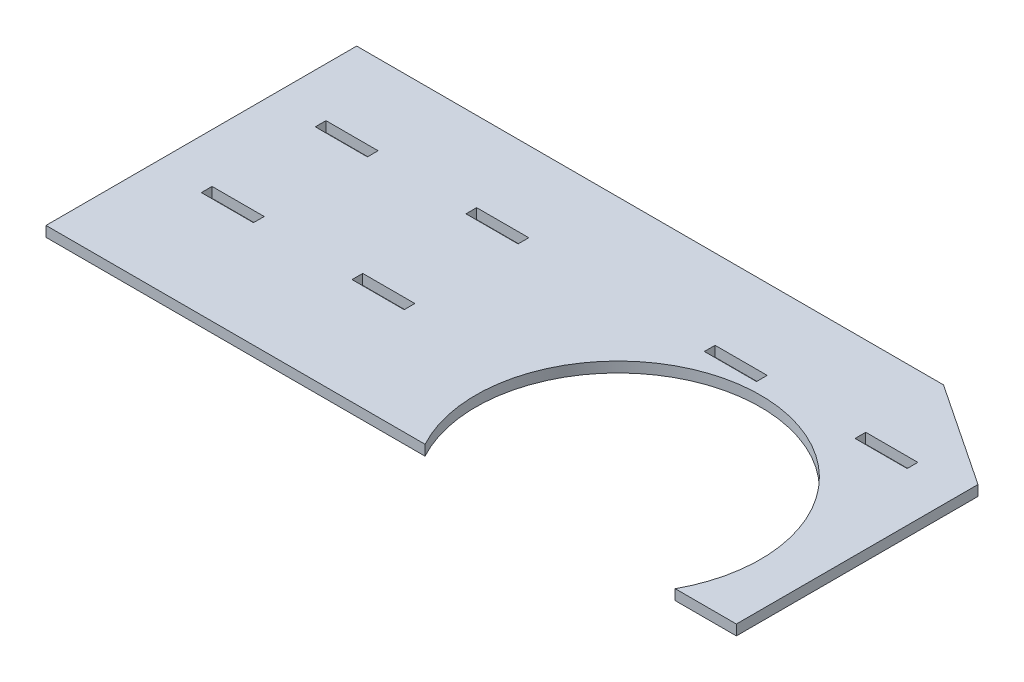
ISO-10303-21;
HEADER;
FILE_DESCRIPTION(('STEP AP214'),'2;1');
FILE_NAME('part.step','',(''),(''),'','','');
FILE_SCHEMA(('AUTOMOTIVE_DESIGN { 1 0 10303 214 1 1 1 1 }'));
ENDSEC;
DATA;
#1=APPLICATION_CONTEXT('core data for automotive mechanical design processes');
#2=APPLICATION_PROTOCOL_DEFINITION('international standard','automotive_design',2000,#1);
#3=PRODUCT_CONTEXT('',#1,'mechanical');
#4=PRODUCT('Part','Part','',(#3));
#5=PRODUCT_RELATED_PRODUCT_CATEGORY('part','',(#4));
#6=PRODUCT_DEFINITION_FORMATION('','',#4);
#7=PRODUCT_DEFINITION_CONTEXT('part definition',#1,'design');
#8=PRODUCT_DEFINITION('design','',#6,#7);
#9=PRODUCT_DEFINITION_SHAPE('','',#8);
#10=(LENGTH_UNIT() NAMED_UNIT(*) SI_UNIT(.MILLI.,.METRE.));
#11=(NAMED_UNIT(*) PLANE_ANGLE_UNIT() SI_UNIT($,.RADIAN.));
#12=(NAMED_UNIT(*) SI_UNIT($,.STERADIAN.) SOLID_ANGLE_UNIT());
#13=UNCERTAINTY_MEASURE_WITH_UNIT(LENGTH_MEASURE(1.E-05),#10,'distance_accuracy_value','');
#14=(GEOMETRIC_REPRESENTATION_CONTEXT(3) GLOBAL_UNCERTAINTY_ASSIGNED_CONTEXT((#13)) GLOBAL_UNIT_ASSIGNED_CONTEXT((#10,
#11,#12)) REPRESENTATION_CONTEXT('',''));
#15=CARTESIAN_POINT('',(0.,0.,0.));
#16=DIRECTION('',(0.,0.,1.));
#17=DIRECTION('',(1.,0.,0.));
#18=AXIS2_PLACEMENT_3D('',#15,#16,#17);
#19=CARTESIAN_POINT('',(146.05,3.,-19.69));
#20=DIRECTION('',(0.,1.,0.));
#21=DIRECTION('',(0.,0.,1.));
#22=AXIS2_PLACEMENT_3D('',#19,#20,#21);
#23=PLANE('',#22);
#24=DIRECTION('',(0.,0.,1.));
#25=VECTOR('',#24,1.);
#26=CARTESIAN_POINT('',(0.,3.,0.));
#27=LINE('',#26,#25);
#28=CARTESIAN_POINT('',(0.,3.,-90.));
#29=VERTEX_POINT('',#28);
#30=CARTESIAN_POINT('',(0.,3.,0.));
#31=VERTEX_POINT('',#30);
#32=EDGE_CURVE('E433',#29,#31,#27,.T.);
#33=ORIENTED_EDGE('',*,*,#32,.T.);
#34=DIRECTION('',(1.,0.,0.));
#35=VECTOR('',#34,1.);
#36=CARTESIAN_POINT('',(0.,3.,0.));
#37=LINE('',#36,#35);
#38=CARTESIAN_POINT('',(109.814085495189,3.,0.));
#39=VERTEX_POINT('',#38);
#40=EDGE_CURVE('E436',#31,#39,#37,.T.);
#41=ORIENTED_EDGE('',*,*,#40,.T.);
#42=CARTESIAN_POINT('',(146.05,3.,-19.69));
#43=DIRECTION('',(0.,-1.,0.));
#44=DIRECTION('',(0.,0.,1.));
#45=AXIS2_PLACEMENT_3D('',#42,#43,#44);
#46=CIRCLE('',#45,41.24);
#47=CARTESIAN_POINT('',(182.285914504811,3.,0.));
#48=VERTEX_POINT('',#47);
#49=EDGE_CURVE('E439',#39,#48,#46,.T.);
#50=ORIENTED_EDGE('',*,*,#49,.T.);
#51=DIRECTION('',(1.,0.,0.));
#52=VECTOR('',#51,1.);
#53=CARTESIAN_POINT('',(182.285914504811,3.,0.));
#54=LINE('',#53,#52);
#55=CARTESIAN_POINT('',(200.,3.,0.));
#56=VERTEX_POINT('',#55);
#57=EDGE_CURVE('E441',#48,#56,#54,.T.);
#58=ORIENTED_EDGE('',*,*,#57,.T.);
#59=DIRECTION('',(0.,0.,-1.));
#60=VECTOR('',#59,1.);
#61=CARTESIAN_POINT('',(200.,3.,0.));
#62=LINE('',#61,#60);
#63=CARTESIAN_POINT('',(200.,3.,-70.));
#64=VERTEX_POINT('',#63);
#65=EDGE_CURVE('E443',#56,#64,#62,.T.);
#66=ORIENTED_EDGE('',*,*,#65,.T.);
#67=DIRECTION('',(-0.832050294337844,0.,-0.554700196225229));
#68=VECTOR('',#67,1.);
#69=CARTESIAN_POINT('',(170.,3.,-90.));
#70=LINE('',#69,#68);
#71=CARTESIAN_POINT('',(170.,3.,-90.));
#72=VERTEX_POINT('',#71);
#73=EDGE_CURVE('E445',#64,#72,#70,.T.);
#74=ORIENTED_EDGE('',*,*,#73,.T.);
#75=DIRECTION('',(-1.,0.,0.));
#76=VECTOR('',#75,1.);
#77=CARTESIAN_POINT('',(0.,3.,-90.));
#78=LINE('',#77,#76);
#79=EDGE_CURVE('E447',#72,#29,#78,.T.);
#80=ORIENTED_EDGE('',*,*,#79,.T.);
#81=EDGE_LOOP('',(#33,#41,#50,#58,#66,#74,#80));
#82=FACE_BOUND('',#81,.T.);
#83=DIRECTION('',(1.,0.,0.));
#84=VECTOR('',#83,1.);
#85=CARTESIAN_POINT('',(14.27,3.,-63.74));
#86=LINE('',#85,#84);
#87=CARTESIAN_POINT('',(14.27,3.,-63.74));
#88=VERTEX_POINT('',#87);
#89=CARTESIAN_POINT('',(29.37,3.,-63.74));
#90=VERTEX_POINT('',#89);
#91=EDGE_CURVE('E404',#88,#90,#86,.T.);
#92=ORIENTED_EDGE('',*,*,#91,.F.);
#93=DIRECTION('',(0.,0.,1.));
#94=VECTOR('',#93,1.);
#95=CARTESIAN_POINT('',(14.27,3.,-66.84));
#96=LINE('',#95,#94);
#97=CARTESIAN_POINT('',(14.27,3.,-66.84));
#98=VERTEX_POINT('',#97);
#99=EDGE_CURVE('E402',#98,#88,#96,.T.);
#100=ORIENTED_EDGE('',*,*,#99,.F.);
#101=DIRECTION('',(-1.,0.,0.));
#102=VECTOR('',#101,1.);
#103=CARTESIAN_POINT('',(14.27,3.,-66.84));
#104=LINE('',#103,#102);
#105=CARTESIAN_POINT('',(29.37,3.,-66.84));
#106=VERTEX_POINT('',#105);
#107=EDGE_CURVE('E410',#106,#98,#104,.T.);
#108=ORIENTED_EDGE('',*,*,#107,.F.);
#109=DIRECTION('',(0.,0.,-1.));
#110=VECTOR('',#109,1.);
#111=CARTESIAN_POINT('',(29.37,3.,-66.84));
#112=LINE('',#111,#110);
#113=EDGE_CURVE('E407',#90,#106,#112,.T.);
#114=ORIENTED_EDGE('',*,*,#113,.F.);
#115=EDGE_LOOP('',(#92,#100,#108,#114));
#116=FACE_BOUND('',#115,.T.);
#117=DIRECTION('',(1.,0.,0.));
#118=VECTOR('',#117,1.);
#119=CARTESIAN_POINT('',(14.27,3.,-30.74));
#120=LINE('',#119,#118);
#121=CARTESIAN_POINT('',(14.27,3.,-30.74));
#122=VERTEX_POINT('',#121);
#123=CARTESIAN_POINT('',(29.37,3.,-30.74));
#124=VERTEX_POINT('',#123);
#125=EDGE_CURVE('E373',#122,#124,#120,.T.);
#126=ORIENTED_EDGE('',*,*,#125,.F.);
#127=DIRECTION('',(0.,0.,1.));
#128=VECTOR('',#127,1.);
#129=CARTESIAN_POINT('',(14.27,3.,-33.84));
#130=LINE('',#129,#128);
#131=CARTESIAN_POINT('',(14.27,3.,-33.84));
#132=VERTEX_POINT('',#131);
#133=EDGE_CURVE('E371',#132,#122,#130,.T.);
#134=ORIENTED_EDGE('',*,*,#133,.F.);
#135=DIRECTION('',(-1.,0.,0.));
#136=VECTOR('',#135,1.);
#137=CARTESIAN_POINT('',(14.27,3.,-33.84));
#138=LINE('',#137,#136);
#139=CARTESIAN_POINT('',(29.37,3.,-33.84));
#140=VERTEX_POINT('',#139);
#141=EDGE_CURVE('E379',#140,#132,#138,.T.);
#142=ORIENTED_EDGE('',*,*,#141,.F.);
#143=DIRECTION('',(0.,0.,-1.));
#144=VECTOR('',#143,1.);
#145=CARTESIAN_POINT('',(29.37,3.,-33.84));
#146=LINE('',#145,#144);
#147=EDGE_CURVE('E376',#124,#140,#146,.T.);
#148=ORIENTED_EDGE('',*,*,#147,.F.);
#149=EDGE_LOOP('',(#126,#134,#142,#148));
#150=FACE_BOUND('',#149,.T.);
#151=DIRECTION('',(-1.,0.,0.));
#152=VECTOR('',#151,1.);
#153=CARTESIAN_POINT('',(73.02,3.,-33.84));
#154=LINE('',#153,#152);
#155=CARTESIAN_POINT('',(73.02,3.,-33.84));
#156=VERTEX_POINT('',#155);
#157=CARTESIAN_POINT('',(57.92,3.,-33.84));
#158=VERTEX_POINT('',#157);
#159=EDGE_CURVE('E342',#156,#158,#154,.T.);
#160=ORIENTED_EDGE('',*,*,#159,.F.);
#161=DIRECTION('',(0.,0.,-1.));
#162=VECTOR('',#161,1.);
#163=CARTESIAN_POINT('',(73.02,3.,-33.84));
#164=LINE('',#163,#162);
#165=CARTESIAN_POINT('',(73.02,3.,-30.74));
#166=VERTEX_POINT('',#165);
#167=EDGE_CURVE('E340',#166,#156,#164,.T.);
#168=ORIENTED_EDGE('',*,*,#167,.F.);
#169=DIRECTION('',(1.,0.,0.));
#170=VECTOR('',#169,1.);
#171=CARTESIAN_POINT('',(73.02,3.,-30.74));
#172=LINE('',#171,#170);
#173=CARTESIAN_POINT('',(57.92,3.,-30.74));
#174=VERTEX_POINT('',#173);
#175=EDGE_CURVE('E348',#174,#166,#172,.T.);
#176=ORIENTED_EDGE('',*,*,#175,.F.);
#177=DIRECTION('',(0.,0.,1.));
#178=VECTOR('',#177,1.);
#179=CARTESIAN_POINT('',(57.92,3.,-33.84));
#180=LINE('',#179,#178);
#181=EDGE_CURVE('E345',#158,#174,#180,.T.);
#182=ORIENTED_EDGE('',*,*,#181,.F.);
#183=EDGE_LOOP('',(#160,#168,#176,#182));
#184=FACE_BOUND('',#183,.T.);
#185=DIRECTION('',(-1.,0.,0.));
#186=VECTOR('',#185,1.);
#187=CARTESIAN_POINT('',(73.02,3.,-66.84));
#188=LINE('',#187,#186);
#189=CARTESIAN_POINT('',(73.02,3.,-66.84));
#190=VERTEX_POINT('',#189);
#191=CARTESIAN_POINT('',(57.92,3.,-66.84));
#192=VERTEX_POINT('',#191);
#193=EDGE_CURVE('E311',#190,#192,#188,.T.);
#194=ORIENTED_EDGE('',*,*,#193,.F.);
#195=DIRECTION('',(0.,0.,-1.));
#196=VECTOR('',#195,1.);
#197=CARTESIAN_POINT('',(73.02,3.,-66.84));
#198=LINE('',#197,#196);
#199=CARTESIAN_POINT('',(73.02,3.,-63.74));
#200=VERTEX_POINT('',#199);
#201=EDGE_CURVE('E309',#200,#190,#198,.T.);
#202=ORIENTED_EDGE('',*,*,#201,.F.);
#203=DIRECTION('',(1.,0.,0.));
#204=VECTOR('',#203,1.);
#205=CARTESIAN_POINT('',(73.02,3.,-63.74));
#206=LINE('',#205,#204);
#207=CARTESIAN_POINT('',(57.92,3.,-63.74));
#208=VERTEX_POINT('',#207);
#209=EDGE_CURVE('E317',#208,#200,#206,.T.);
#210=ORIENTED_EDGE('',*,*,#209,.F.);
#211=DIRECTION('',(0.,0.,1.));
#212=VECTOR('',#211,1.);
#213=CARTESIAN_POINT('',(57.92,3.,-66.84));
#214=LINE('',#213,#212);
#215=EDGE_CURVE('E314',#192,#208,#214,.T.);
#216=ORIENTED_EDGE('',*,*,#215,.F.);
#217=EDGE_LOOP('',(#194,#202,#210,#216));
#218=FACE_BOUND('',#217,.T.);
#219=DIRECTION('',(1.,0.,0.));
#220=VECTOR('',#219,1.);
#221=CARTESIAN_POINT('',(126.99,3.,-63.74));
#222=LINE('',#221,#220);
#223=CARTESIAN_POINT('',(126.99,3.,-63.74));
#224=VERTEX_POINT('',#223);
#225=CARTESIAN_POINT('',(142.09,3.,-63.74));
#226=VERTEX_POINT('',#225);
#227=EDGE_CURVE('E280',#224,#226,#222,.T.);
#228=ORIENTED_EDGE('',*,*,#227,.F.);
#229=DIRECTION('',(0.,0.,1.));
#230=VECTOR('',#229,1.);
#231=CARTESIAN_POINT('',(126.99,3.,-66.84));
#232=LINE('',#231,#230);
#233=CARTESIAN_POINT('',(126.99,3.,-66.84));
#234=VERTEX_POINT('',#233);
#235=EDGE_CURVE('E278',#234,#224,#232,.T.);
#236=ORIENTED_EDGE('',*,*,#235,.F.);
#237=DIRECTION('',(-1.,0.,0.));
#238=VECTOR('',#237,1.);
#239=CARTESIAN_POINT('',(126.99,3.,-66.84));
#240=LINE('',#239,#238);
#241=CARTESIAN_POINT('',(142.09,3.,-66.84));
#242=VERTEX_POINT('',#241);
#243=EDGE_CURVE('E286',#242,#234,#240,.T.);
#244=ORIENTED_EDGE('',*,*,#243,.F.);
#245=DIRECTION('',(0.,0.,-1.));
#246=VECTOR('',#245,1.);
#247=CARTESIAN_POINT('',(142.09,3.,-66.84));
#248=LINE('',#247,#246);
#249=EDGE_CURVE('E283',#226,#242,#248,.T.);
#250=ORIENTED_EDGE('',*,*,#249,.F.);
#251=EDGE_LOOP('',(#228,#236,#244,#250));
#252=FACE_BOUND('',#251,.T.);
#253=DIRECTION('',(1.,0.,0.));
#254=VECTOR('',#253,1.);
#255=CARTESIAN_POINT('',(170.64,3.,-63.74));
#256=LINE('',#255,#254);
#257=CARTESIAN_POINT('',(170.64,3.,-63.74));
#258=VERTEX_POINT('',#257);
#259=CARTESIAN_POINT('',(185.74,3.,-63.74));
#260=VERTEX_POINT('',#259);
#261=EDGE_CURVE('E250',#258,#260,#256,.T.);
#262=ORIENTED_EDGE('',*,*,#261,.F.);
#263=DIRECTION('',(0.,0.,1.));
#264=VECTOR('',#263,1.);
#265=CARTESIAN_POINT('',(170.64,3.,-66.84));
#266=LINE('',#265,#264);
#267=CARTESIAN_POINT('',(170.64,3.,-66.84));
#268=VERTEX_POINT('',#267);
#269=EDGE_CURVE('E242',#268,#258,#266,.T.);
#270=ORIENTED_EDGE('',*,*,#269,.F.);
#271=DIRECTION('',(-1.,0.,0.));
#272=VECTOR('',#271,1.);
#273=CARTESIAN_POINT('',(170.64,3.,-66.84));
#274=LINE('',#273,#272);
#275=CARTESIAN_POINT('',(185.74,3.,-66.84));
#276=VERTEX_POINT('',#275);
#277=EDGE_CURVE('E264',#276,#268,#274,.T.);
#278=ORIENTED_EDGE('',*,*,#277,.F.);
#279=DIRECTION('',(0.,0.,-1.));
#280=VECTOR('',#279,1.);
#281=CARTESIAN_POINT('',(185.74,3.,-66.84));
#282=LINE('',#281,#280);
#283=EDGE_CURVE('E262',#260,#276,#282,.T.);
#284=ORIENTED_EDGE('',*,*,#283,.F.);
#285=EDGE_LOOP('',(#262,#270,#278,#284));
#286=FACE_BOUND('',#285,.T.);
#287=ADVANCED_FACE('F39',(#82,#116,#150,#184,#218,#252,#286),#23,.T.);
#288=CARTESIAN_POINT('',(146.05,0.,-19.69));
#289=DIRECTION('',(0.,1.,0.));
#290=DIRECTION('',(0.,0.,1.));
#291=AXIS2_PLACEMENT_3D('',#288,#289,#290);
#292=PLANE('',#291);
#293=DIRECTION('',(0.,0.,1.));
#294=VECTOR('',#293,1.);
#295=CARTESIAN_POINT('',(126.99,0.,-66.84));
#296=LINE('',#295,#294);
#297=CARTESIAN_POINT('',(126.99,0.,-66.84));
#298=VERTEX_POINT('',#297);
#299=CARTESIAN_POINT('',(126.99,0.,-63.74));
#300=VERTEX_POINT('',#299);
#301=EDGE_CURVE('E258',#298,#300,#296,.T.);
#302=ORIENTED_EDGE('',*,*,#301,.T.);
#303=DIRECTION('',(1.,0.,0.));
#304=VECTOR('',#303,1.);
#305=CARTESIAN_POINT('',(126.99,0.,-63.74));
#306=LINE('',#305,#304);
#307=CARTESIAN_POINT('',(142.09,0.,-63.74));
#308=VERTEX_POINT('',#307);
#309=EDGE_CURVE('E291',#300,#308,#306,.T.);
#310=ORIENTED_EDGE('',*,*,#309,.T.);
#311=DIRECTION('',(0.,0.,-1.));
#312=VECTOR('',#311,1.);
#313=CARTESIAN_POINT('',(142.09,0.,-66.84));
#314=LINE('',#313,#312);
#315=CARTESIAN_POINT('',(142.09,0.,-66.84));
#316=VERTEX_POINT('',#315);
#317=EDGE_CURVE('E294',#308,#316,#314,.T.);
#318=ORIENTED_EDGE('',*,*,#317,.T.);
#319=DIRECTION('',(-1.,0.,0.));
#320=VECTOR('',#319,1.);
#321=CARTESIAN_POINT('',(126.99,0.,-66.84));
#322=LINE('',#321,#320);
#323=EDGE_CURVE('E281',#316,#298,#322,.T.);
#324=ORIENTED_EDGE('',*,*,#323,.T.);
#325=EDGE_LOOP('',(#302,#310,#318,#324));
#326=FACE_BOUND('',#325,.T.);
#327=DIRECTION('',(0.,0.,-1.));
#328=VECTOR('',#327,1.);
#329=CARTESIAN_POINT('',(73.02,0.,-33.84));
#330=LINE('',#329,#328);
#331=CARTESIAN_POINT('',(73.02,0.,-30.74));
#332=VERTEX_POINT('',#331);
#333=CARTESIAN_POINT('',(73.02,0.,-33.84));
#334=VERTEX_POINT('',#333);
#335=EDGE_CURVE('E339',#332,#334,#330,.T.);
#336=ORIENTED_EDGE('',*,*,#335,.T.);
#337=DIRECTION('',(-1.,0.,0.));
#338=VECTOR('',#337,1.);
#339=CARTESIAN_POINT('',(73.02,0.,-33.84));
#340=LINE('',#339,#338);
#341=CARTESIAN_POINT('',(57.92,0.,-33.84));
#342=VERTEX_POINT('',#341);
#343=EDGE_CURVE('E353',#334,#342,#340,.T.);
#344=ORIENTED_EDGE('',*,*,#343,.T.);
#345=DIRECTION('',(0.,0.,1.));
#346=VECTOR('',#345,1.);
#347=CARTESIAN_POINT('',(57.92,0.,-33.84));
#348=LINE('',#347,#346);
#349=CARTESIAN_POINT('',(57.92,0.,-30.74));
#350=VERTEX_POINT('',#349);
#351=EDGE_CURVE('E356',#342,#350,#348,.T.);
#352=ORIENTED_EDGE('',*,*,#351,.T.);
#353=DIRECTION('',(1.,0.,0.));
#354=VECTOR('',#353,1.);
#355=CARTESIAN_POINT('',(73.02,0.,-30.74));
#356=LINE('',#355,#354);
#357=EDGE_CURVE('E343',#350,#332,#356,.T.);
#358=ORIENTED_EDGE('',*,*,#357,.T.);
#359=EDGE_LOOP('',(#336,#344,#352,#358));
#360=FACE_BOUND('',#359,.T.);
#361=DIRECTION('',(0.,0.,1.));
#362=VECTOR('',#361,1.);
#363=CARTESIAN_POINT('',(14.27,0.,-66.84));
#364=LINE('',#363,#362);
#365=CARTESIAN_POINT('',(14.27,0.,-66.84));
#366=VERTEX_POINT('',#365);
#367=CARTESIAN_POINT('',(14.27,0.,-63.74));
#368=VERTEX_POINT('',#367);
#369=EDGE_CURVE('E401',#366,#368,#364,.T.);
#370=ORIENTED_EDGE('',*,*,#369,.T.);
#371=DIRECTION('',(1.,0.,0.));
#372=VECTOR('',#371,1.);
#373=CARTESIAN_POINT('',(14.27,0.,-63.74));
#374=LINE('',#373,#372);
#375=CARTESIAN_POINT('',(29.37,0.,-63.74));
#376=VERTEX_POINT('',#375);
#377=EDGE_CURVE('E415',#368,#376,#374,.T.);
#378=ORIENTED_EDGE('',*,*,#377,.T.);
#379=DIRECTION('',(0.,0.,-1.));
#380=VECTOR('',#379,1.);
#381=CARTESIAN_POINT('',(29.37,0.,-66.84));
#382=LINE('',#381,#380);
#383=CARTESIAN_POINT('',(29.37,0.,-66.84));
#384=VERTEX_POINT('',#383);
#385=EDGE_CURVE('E418',#376,#384,#382,.T.);
#386=ORIENTED_EDGE('',*,*,#385,.T.);
#387=DIRECTION('',(-1.,0.,0.));
#388=VECTOR('',#387,1.);
#389=CARTESIAN_POINT('',(14.27,0.,-66.84));
#390=LINE('',#389,#388);
#391=EDGE_CURVE('E405',#384,#366,#390,.T.);
#392=ORIENTED_EDGE('',*,*,#391,.T.);
#393=EDGE_LOOP('',(#370,#378,#386,#392));
#394=FACE_BOUND('',#393,.T.);
#395=DIRECTION('',(0.,0.,1.));
#396=VECTOR('',#395,1.);
#397=CARTESIAN_POINT('',(0.,0.,0.));
#398=LINE('',#397,#396);
#399=CARTESIAN_POINT('',(0.,0.,-90.));
#400=VERTEX_POINT('',#399);
#401=CARTESIAN_POINT('',(0.,0.,0.));
#402=VERTEX_POINT('',#401);
#403=EDGE_CURVE('E432',#400,#402,#398,.T.);
#404=ORIENTED_EDGE('',*,*,#403,.F.);
#405=DIRECTION('',(-1.,0.,0.));
#406=VECTOR('',#405,1.);
#407=CARTESIAN_POINT('',(0.,0.,-90.));
#408=LINE('',#407,#406);
#409=CARTESIAN_POINT('',(170.,0.,-90.));
#410=VERTEX_POINT('',#409);
#411=EDGE_CURVE('E437',#410,#400,#408,.T.);
#412=ORIENTED_EDGE('',*,*,#411,.F.);
#413=DIRECTION('',(-0.832050294337844,0.,-0.554700196225229));
#414=VECTOR('',#413,1.);
#415=CARTESIAN_POINT('',(170.,0.,-90.));
#416=LINE('',#415,#414);
#417=CARTESIAN_POINT('',(200.,0.,-70.));
#418=VERTEX_POINT('',#417);
#419=EDGE_CURVE('E460',#418,#410,#416,.T.);
#420=ORIENTED_EDGE('',*,*,#419,.F.);
#421=DIRECTION('',(0.,0.,-1.));
#422=VECTOR('',#421,1.);
#423=CARTESIAN_POINT('',(200.,0.,0.));
#424=LINE('',#423,#422);
#425=CARTESIAN_POINT('',(200.,0.,0.));
#426=VERTEX_POINT('',#425);
#427=EDGE_CURVE('E458',#426,#418,#424,.T.);
#428=ORIENTED_EDGE('',*,*,#427,.F.);
#429=DIRECTION('',(1.,0.,0.));
#430=VECTOR('',#429,1.);
#431=CARTESIAN_POINT('',(182.285914504811,0.,0.));
#432=LINE('',#431,#430);
#433=CARTESIAN_POINT('',(182.285914504811,0.,0.));
#434=VERTEX_POINT('',#433);
#435=EDGE_CURVE('E456',#434,#426,#432,.T.);
#436=ORIENTED_EDGE('',*,*,#435,.F.);
#437=CARTESIAN_POINT('',(146.05,0.,-19.69));
#438=DIRECTION('',(0.,-1.,0.));
#439=DIRECTION('',(0.,0.,1.));
#440=AXIS2_PLACEMENT_3D('',#437,#438,#439);
#441=CIRCLE('',#440,41.24);
#442=CARTESIAN_POINT('',(109.814085495189,0.,0.));
#443=VERTEX_POINT('',#442);
#444=EDGE_CURVE('E454',#443,#434,#441,.T.);
#445=ORIENTED_EDGE('',*,*,#444,.F.);
#446=DIRECTION('',(1.,0.,0.));
#447=VECTOR('',#446,1.);
#448=CARTESIAN_POINT('',(0.,0.,0.));
#449=LINE('',#448,#447);
#450=EDGE_CURVE('E452',#402,#443,#449,.T.);
#451=ORIENTED_EDGE('',*,*,#450,.F.);
#452=EDGE_LOOP('',(#404,#412,#420,#428,#436,#445,#451));
#453=FACE_BOUND('',#452,.T.);
#454=DIRECTION('',(0.,0.,1.));
#455=VECTOR('',#454,1.);
#456=CARTESIAN_POINT('',(14.27,0.,-33.84));
#457=LINE('',#456,#455);
#458=CARTESIAN_POINT('',(14.27,0.,-33.84));
#459=VERTEX_POINT('',#458);
#460=CARTESIAN_POINT('',(14.27,0.,-30.74));
#461=VERTEX_POINT('',#460);
#462=EDGE_CURVE('E370',#459,#461,#457,.T.);
#463=ORIENTED_EDGE('',*,*,#462,.T.);
#464=DIRECTION('',(1.,0.,0.));
#465=VECTOR('',#464,1.);
#466=CARTESIAN_POINT('',(14.27,0.,-30.74));
#467=LINE('',#466,#465);
#468=CARTESIAN_POINT('',(29.37,0.,-30.74));
#469=VERTEX_POINT('',#468);
#470=EDGE_CURVE('E384',#461,#469,#467,.T.);
#471=ORIENTED_EDGE('',*,*,#470,.T.);
#472=DIRECTION('',(0.,0.,-1.));
#473=VECTOR('',#472,1.);
#474=CARTESIAN_POINT('',(29.37,0.,-33.84));
#475=LINE('',#474,#473);
#476=CARTESIAN_POINT('',(29.37,0.,-33.84));
#477=VERTEX_POINT('',#476);
#478=EDGE_CURVE('E387',#469,#477,#475,.T.);
#479=ORIENTED_EDGE('',*,*,#478,.T.);
#480=DIRECTION('',(-1.,0.,0.));
#481=VECTOR('',#480,1.);
#482=CARTESIAN_POINT('',(14.27,0.,-33.84));
#483=LINE('',#482,#481);
#484=EDGE_CURVE('E374',#477,#459,#483,.T.);
#485=ORIENTED_EDGE('',*,*,#484,.T.);
#486=EDGE_LOOP('',(#463,#471,#479,#485));
#487=FACE_BOUND('',#486,.T.);
#488=DIRECTION('',(0.,0.,-1.));
#489=VECTOR('',#488,1.);
#490=CARTESIAN_POINT('',(73.02,0.,-66.84));
#491=LINE('',#490,#489);
#492=CARTESIAN_POINT('',(73.02,0.,-63.74));
#493=VERTEX_POINT('',#492);
#494=CARTESIAN_POINT('',(73.02,0.,-66.84));
#495=VERTEX_POINT('',#494);
#496=EDGE_CURVE('E308',#493,#495,#491,.T.);
#497=ORIENTED_EDGE('',*,*,#496,.T.);
#498=DIRECTION('',(-1.,0.,0.));
#499=VECTOR('',#498,1.);
#500=CARTESIAN_POINT('',(73.02,0.,-66.84));
#501=LINE('',#500,#499);
#502=CARTESIAN_POINT('',(57.92,0.,-66.84));
#503=VERTEX_POINT('',#502);
#504=EDGE_CURVE('E322',#495,#503,#501,.T.);
#505=ORIENTED_EDGE('',*,*,#504,.T.);
#506=DIRECTION('',(0.,0.,1.));
#507=VECTOR('',#506,1.);
#508=CARTESIAN_POINT('',(57.92,0.,-66.84));
#509=LINE('',#508,#507);
#510=CARTESIAN_POINT('',(57.92,0.,-63.74));
#511=VERTEX_POINT('',#510);
#512=EDGE_CURVE('E325',#503,#511,#509,.T.);
#513=ORIENTED_EDGE('',*,*,#512,.T.);
#514=DIRECTION('',(1.,0.,0.));
#515=VECTOR('',#514,1.);
#516=CARTESIAN_POINT('',(73.02,0.,-63.74));
#517=LINE('',#516,#515);
#518=EDGE_CURVE('E312',#511,#493,#517,.T.);
#519=ORIENTED_EDGE('',*,*,#518,.T.);
#520=EDGE_LOOP('',(#497,#505,#513,#519));
#521=FACE_BOUND('',#520,.T.);
#522=DIRECTION('',(0.,0.,1.));
#523=VECTOR('',#522,1.);
#524=CARTESIAN_POINT('',(170.64,0.,-66.84));
#525=LINE('',#524,#523);
#526=CARTESIAN_POINT('',(170.64,0.,-66.84));
#527=VERTEX_POINT('',#526);
#528=CARTESIAN_POINT('',(170.64,0.,-63.74));
#529=VERTEX_POINT('',#528);
#530=EDGE_CURVE('E62',#527,#529,#525,.T.);
#531=ORIENTED_EDGE('',*,*,#530,.T.);
#532=DIRECTION('',(1.,0.,0.));
#533=VECTOR('',#532,1.);
#534=CARTESIAN_POINT('',(170.64,0.,-63.74));
#535=LINE('',#534,#533);
#536=CARTESIAN_POINT('',(185.74,0.,-63.74));
#537=VERTEX_POINT('',#536);
#538=EDGE_CURVE('E257',#529,#537,#535,.T.);
#539=ORIENTED_EDGE('',*,*,#538,.T.);
#540=DIRECTION('',(0.,0.,-1.));
#541=VECTOR('',#540,1.);
#542=CARTESIAN_POINT('',(185.74,0.,-66.84));
#543=LINE('',#542,#541);
#544=CARTESIAN_POINT('',(185.74,0.,-66.84));
#545=VERTEX_POINT('',#544);
#546=EDGE_CURVE('E270',#537,#545,#543,.T.);
#547=ORIENTED_EDGE('',*,*,#546,.T.);
#548=DIRECTION('',(-1.,0.,0.));
#549=VECTOR('',#548,1.);
#550=CARTESIAN_POINT('',(170.64,0.,-66.84));
#551=LINE('',#550,#549);
#552=EDGE_CURVE('E251',#545,#527,#551,.T.);
#553=ORIENTED_EDGE('',*,*,#552,.T.);
#554=EDGE_LOOP('',(#531,#539,#547,#553));
#555=FACE_BOUND('',#554,.T.);
#556=ADVANCED_FACE('F487',(#326,#360,#394,#453,#487,#521,#555),#292,.F.);
#557=CARTESIAN_POINT('',(0.,3.,0.));
#558=DIRECTION('',(1.,0.,0.));
#559=DIRECTION('',(0.,0.,-1.));
#560=AXIS2_PLACEMENT_3D('',#557,#558,#559);
#561=PLANE('',#560);
#562=ORIENTED_EDGE('',*,*,#403,.T.);
#563=DIRECTION('',(0.,-1.,0.));
#564=VECTOR('',#563,1.);
#565=CARTESIAN_POINT('',(0.,3.,0.));
#566=LINE('',#565,#564);
#567=EDGE_CURVE('E11',#31,#402,#566,.T.);
#568=ORIENTED_EDGE('',*,*,#567,.F.);
#569=ORIENTED_EDGE('',*,*,#32,.F.);
#570=DIRECTION('',(0.,-1.,0.));
#571=VECTOR('',#570,1.);
#572=CARTESIAN_POINT('',(0.,3.,-90.));
#573=LINE('',#572,#571);
#574=EDGE_CURVE('E449',#29,#400,#573,.T.);
#575=ORIENTED_EDGE('',*,*,#574,.T.);
#576=EDGE_LOOP('',(#562,#568,#569,#575));
#577=FACE_BOUND('',#576,.T.);
#578=ADVANCED_FACE('F41',(#577),#561,.F.);
#579=CARTESIAN_POINT('',(0.,3.,0.));
#580=DIRECTION('',(0.,0.,-1.));
#581=DIRECTION('',(-1.,0.,0.));
#582=AXIS2_PLACEMENT_3D('',#579,#580,#581);
#583=PLANE('',#582);
#584=ORIENTED_EDGE('',*,*,#450,.T.);
#585=DIRECTION('',(0.,-1.,0.));
#586=VECTOR('',#585,1.);
#587=CARTESIAN_POINT('',(109.814085495189,3.,0.));
#588=LINE('',#587,#586);
#589=EDGE_CURVE('E47',#39,#443,#588,.T.);
#590=ORIENTED_EDGE('',*,*,#589,.F.);
#591=ORIENTED_EDGE('',*,*,#40,.F.);
#592=ORIENTED_EDGE('',*,*,#567,.T.);
#593=EDGE_LOOP('',(#584,#590,#591,#592));
#594=FACE_BOUND('',#593,.T.);
#595=ADVANCED_FACE('F505',(#594),#583,.F.);
#596=CARTESIAN_POINT('',(146.05,3.,-19.69));
#597=DIRECTION('',(0.,-1.,0.));
#598=DIRECTION('',(0.,0.,-1.));
#599=AXIS2_PLACEMENT_3D('',#596,#597,#598);
#600=CYLINDRICAL_SURFACE('',#599,41.24);
#601=ORIENTED_EDGE('',*,*,#444,.T.);
#602=DIRECTION('',(0.,-1.,0.));
#603=VECTOR('',#602,1.);
#604=CARTESIAN_POINT('',(182.285914504811,3.,0.));
#605=LINE('',#604,#603);
#606=EDGE_CURVE('E474',#48,#434,#605,.T.);
#607=ORIENTED_EDGE('',*,*,#606,.F.);
#608=ORIENTED_EDGE('',*,*,#49,.F.);
#609=ORIENTED_EDGE('',*,*,#589,.T.);
#610=EDGE_LOOP('',(#601,#607,#608,#609));
#611=FACE_BOUND('',#610,.T.);
#612=ADVANCED_FACE('F481',(#611),#600,.F.);
#613=CARTESIAN_POINT('',(182.285914504811,3.,0.));
#614=DIRECTION('',(0.,0.,-1.));
#615=DIRECTION('',(-1.,0.,0.));
#616=AXIS2_PLACEMENT_3D('',#613,#614,#615);
#617=PLANE('',#616);
#618=ORIENTED_EDGE('',*,*,#435,.T.);
#619=DIRECTION('',(0.,-1.,0.));
#620=VECTOR('',#619,1.);
#621=CARTESIAN_POINT('',(200.,3.,0.));
#622=LINE('',#621,#620);
#623=EDGE_CURVE('E471',#56,#426,#622,.T.);
#624=ORIENTED_EDGE('',*,*,#623,.F.);
#625=ORIENTED_EDGE('',*,*,#57,.F.);
#626=ORIENTED_EDGE('',*,*,#606,.T.);
#627=EDGE_LOOP('',(#618,#624,#625,#626));
#628=FACE_BOUND('',#627,.T.);
#629=ADVANCED_FACE('F493',(#628),#617,.F.);
#630=CARTESIAN_POINT('',(200.,3.,0.));
#631=DIRECTION('',(-1.,0.,0.));
#632=DIRECTION('',(0.,0.,1.));
#633=AXIS2_PLACEMENT_3D('',#630,#631,#632);
#634=PLANE('',#633);
#635=ORIENTED_EDGE('',*,*,#427,.T.);
#636=DIRECTION('',(0.,-1.,0.));
#637=VECTOR('',#636,1.);
#638=CARTESIAN_POINT('',(200.,3.,-70.));
#639=LINE('',#638,#637);
#640=EDGE_CURVE('E468',#64,#418,#639,.T.);
#641=ORIENTED_EDGE('',*,*,#640,.F.);
#642=ORIENTED_EDGE('',*,*,#65,.F.);
#643=ORIENTED_EDGE('',*,*,#623,.T.);
#644=EDGE_LOOP('',(#635,#641,#642,#643));
#645=FACE_BOUND('',#644,.T.);
#646=ADVANCED_FACE('F497',(#645),#634,.F.);
#647=CARTESIAN_POINT('',(170.,3.,-90.));
#648=DIRECTION('',(-0.554700196225229,0.,0.832050294337844));
#649=DIRECTION('',(0.832050294337844,0.,0.554700196225229));
#650=AXIS2_PLACEMENT_3D('',#647,#648,#649);
#651=PLANE('',#650);
#652=ORIENTED_EDGE('',*,*,#419,.T.);
#653=DIRECTION('',(0.,-1.,0.));
#654=VECTOR('',#653,1.);
#655=CARTESIAN_POINT('',(170.,3.,-90.));
#656=LINE('',#655,#654);
#657=EDGE_CURVE('E465',#72,#410,#656,.T.);
#658=ORIENTED_EDGE('',*,*,#657,.F.);
#659=ORIENTED_EDGE('',*,*,#73,.F.);
#660=ORIENTED_EDGE('',*,*,#640,.T.);
#661=EDGE_LOOP('',(#652,#658,#659,#660));
#662=FACE_BOUND('',#661,.T.);
#663=ADVANCED_FACE('F513',(#662),#651,.F.);
#664=CARTESIAN_POINT('',(0.,3.,-90.));
#665=DIRECTION('',(0.,0.,1.));
#666=DIRECTION('',(1.,0.,0.));
#667=AXIS2_PLACEMENT_3D('',#664,#665,#666);
#668=PLANE('',#667);
#669=ORIENTED_EDGE('',*,*,#411,.T.);
#670=ORIENTED_EDGE('',*,*,#574,.F.);
#671=ORIENTED_EDGE('',*,*,#79,.F.);
#672=ORIENTED_EDGE('',*,*,#657,.T.);
#673=EDGE_LOOP('',(#669,#670,#671,#672));
#674=FACE_BOUND('',#673,.T.);
#675=ADVANCED_FACE('F510',(#674),#668,.F.);
#676=CARTESIAN_POINT('',(14.27,3.,-66.84));
#677=DIRECTION('',(1.,0.,0.));
#678=DIRECTION('',(0.,0.,-1.));
#679=AXIS2_PLACEMENT_3D('',#676,#677,#678);
#680=PLANE('',#679);
#681=ORIENTED_EDGE('',*,*,#369,.F.);
#682=DIRECTION('',(0.,-1.,0.));
#683=VECTOR('',#682,1.);
#684=CARTESIAN_POINT('',(14.27,3.,-66.84));
#685=LINE('',#684,#683);
#686=EDGE_CURVE('E412',#98,#366,#685,.T.);
#687=ORIENTED_EDGE('',*,*,#686,.F.);
#688=ORIENTED_EDGE('',*,*,#99,.T.);
#689=DIRECTION('',(0.,-1.,0.));
#690=VECTOR('',#689,1.);
#691=CARTESIAN_POINT('',(14.27,3.,-63.74));
#692=LINE('',#691,#690);
#693=EDGE_CURVE('E429',#88,#368,#692,.T.);
#694=ORIENTED_EDGE('',*,*,#693,.T.);
#695=EDGE_LOOP('',(#681,#687,#688,#694));
#696=FACE_BOUND('',#695,.T.);
#697=ADVANCED_FACE('F520',(#696),#680,.T.);
#698=CARTESIAN_POINT('',(14.27,3.,-63.74));
#699=DIRECTION('',(0.,0.,-1.));
#700=DIRECTION('',(-1.,0.,0.));
#701=AXIS2_PLACEMENT_3D('',#698,#699,#700);
#702=PLANE('',#701);
#703=ORIENTED_EDGE('',*,*,#377,.F.);
#704=ORIENTED_EDGE('',*,*,#693,.F.);
#705=ORIENTED_EDGE('',*,*,#91,.T.);
#706=DIRECTION('',(0.,-1.,0.));
#707=VECTOR('',#706,1.);
#708=CARTESIAN_POINT('',(29.37,3.,-63.74));
#709=LINE('',#708,#707);
#710=EDGE_CURVE('E427',#90,#376,#709,.T.);
#711=ORIENTED_EDGE('',*,*,#710,.T.);
#712=EDGE_LOOP('',(#703,#704,#705,#711));
#713=FACE_BOUND('',#712,.T.);
#714=ADVANCED_FACE('F533',(#713),#702,.T.);
#715=CARTESIAN_POINT('',(29.37,3.,-66.84));
#716=DIRECTION('',(-1.,0.,0.));
#717=DIRECTION('',(0.,0.,1.));
#718=AXIS2_PLACEMENT_3D('',#715,#716,#717);
#719=PLANE('',#718);
#720=ORIENTED_EDGE('',*,*,#385,.F.);
#721=ORIENTED_EDGE('',*,*,#710,.F.);
#722=ORIENTED_EDGE('',*,*,#113,.T.);
#723=DIRECTION('',(0.,-1.,0.));
#724=VECTOR('',#723,1.);
#725=CARTESIAN_POINT('',(29.37,3.,-66.84));
#726=LINE('',#725,#724);
#727=EDGE_CURVE('E425',#106,#384,#726,.T.);
#728=ORIENTED_EDGE('',*,*,#727,.T.);
#729=EDGE_LOOP('',(#720,#721,#722,#728));
#730=FACE_BOUND('',#729,.T.);
#731=ADVANCED_FACE('F537',(#730),#719,.T.);
#732=CARTESIAN_POINT('',(14.27,3.,-66.84));
#733=DIRECTION('',(0.,0.,1.));
#734=DIRECTION('',(1.,0.,0.));
#735=AXIS2_PLACEMENT_3D('',#732,#733,#734);
#736=PLANE('',#735);
#737=ORIENTED_EDGE('',*,*,#391,.F.);
#738=ORIENTED_EDGE('',*,*,#727,.F.);
#739=ORIENTED_EDGE('',*,*,#107,.T.);
#740=ORIENTED_EDGE('',*,*,#686,.T.);
#741=EDGE_LOOP('',(#737,#738,#739,#740));
#742=FACE_BOUND('',#741,.T.);
#743=ADVANCED_FACE('F541',(#742),#736,.T.);
#744=CARTESIAN_POINT('',(14.27,3.,-33.84));
#745=DIRECTION('',(1.,0.,0.));
#746=DIRECTION('',(0.,0.,-1.));
#747=AXIS2_PLACEMENT_3D('',#744,#745,#746);
#748=PLANE('',#747);
#749=ORIENTED_EDGE('',*,*,#462,.F.);
#750=DIRECTION('',(0.,-1.,0.));
#751=VECTOR('',#750,1.);
#752=CARTESIAN_POINT('',(14.27,3.,-33.84));
#753=LINE('',#752,#751);
#754=EDGE_CURVE('E381',#132,#459,#753,.T.);
#755=ORIENTED_EDGE('',*,*,#754,.F.);
#756=ORIENTED_EDGE('',*,*,#133,.T.);
#757=DIRECTION('',(0.,-1.,0.));
#758=VECTOR('',#757,1.);
#759=CARTESIAN_POINT('',(14.27,3.,-30.74));
#760=LINE('',#759,#758);
#761=EDGE_CURVE('E398',#122,#461,#760,.T.);
#762=ORIENTED_EDGE('',*,*,#761,.T.);
#763=EDGE_LOOP('',(#749,#755,#756,#762));
#764=FACE_BOUND('',#763,.T.);
#765=ADVANCED_FACE('F545',(#764),#748,.T.);
#766=CARTESIAN_POINT('',(14.27,3.,-30.74));
#767=DIRECTION('',(0.,0.,-1.));
#768=DIRECTION('',(-1.,0.,0.));
#769=AXIS2_PLACEMENT_3D('',#766,#767,#768);
#770=PLANE('',#769);
#771=ORIENTED_EDGE('',*,*,#470,.F.);
#772=ORIENTED_EDGE('',*,*,#761,.F.);
#773=ORIENTED_EDGE('',*,*,#125,.T.);
#774=DIRECTION('',(0.,-1.,0.));
#775=VECTOR('',#774,1.);
#776=CARTESIAN_POINT('',(29.37,3.,-30.74));
#777=LINE('',#776,#775);
#778=EDGE_CURVE('E396',#124,#469,#777,.T.);
#779=ORIENTED_EDGE('',*,*,#778,.T.);
#780=EDGE_LOOP('',(#771,#772,#773,#779));
#781=FACE_BOUND('',#780,.T.);
#782=ADVANCED_FACE('F549',(#781),#770,.T.);
#783=CARTESIAN_POINT('',(29.37,3.,-33.84));
#784=DIRECTION('',(-1.,0.,0.));
#785=DIRECTION('',(0.,0.,1.));
#786=AXIS2_PLACEMENT_3D('',#783,#784,#785);
#787=PLANE('',#786);
#788=ORIENTED_EDGE('',*,*,#478,.F.);
#789=ORIENTED_EDGE('',*,*,#778,.F.);
#790=ORIENTED_EDGE('',*,*,#147,.T.);
#791=DIRECTION('',(0.,-1.,0.));
#792=VECTOR('',#791,1.);
#793=CARTESIAN_POINT('',(29.37,3.,-33.84));
#794=LINE('',#793,#792);
#795=EDGE_CURVE('E394',#140,#477,#794,.T.);
#796=ORIENTED_EDGE('',*,*,#795,.T.);
#797=EDGE_LOOP('',(#788,#789,#790,#796));
#798=FACE_BOUND('',#797,.T.);
#799=ADVANCED_FACE('F553',(#798),#787,.T.);
#800=CARTESIAN_POINT('',(14.27,3.,-33.84));
#801=DIRECTION('',(0.,0.,1.));
#802=DIRECTION('',(1.,0.,0.));
#803=AXIS2_PLACEMENT_3D('',#800,#801,#802);
#804=PLANE('',#803);
#805=ORIENTED_EDGE('',*,*,#484,.F.);
#806=ORIENTED_EDGE('',*,*,#795,.F.);
#807=ORIENTED_EDGE('',*,*,#141,.T.);
#808=ORIENTED_EDGE('',*,*,#754,.T.);
#809=EDGE_LOOP('',(#805,#806,#807,#808));
#810=FACE_BOUND('',#809,.T.);
#811=ADVANCED_FACE('F557',(#810),#804,.T.);
#812=CARTESIAN_POINT('',(73.02,3.,-33.84));
#813=DIRECTION('',(-1.,0.,0.));
#814=DIRECTION('',(0.,0.,1.));
#815=AXIS2_PLACEMENT_3D('',#812,#813,#814);
#816=PLANE('',#815);
#817=ORIENTED_EDGE('',*,*,#335,.F.);
#818=DIRECTION('',(0.,-1.,0.));
#819=VECTOR('',#818,1.);
#820=CARTESIAN_POINT('',(73.02,3.,-30.74));
#821=LINE('',#820,#819);
#822=EDGE_CURVE('E350',#166,#332,#821,.T.);
#823=ORIENTED_EDGE('',*,*,#822,.F.);
#824=ORIENTED_EDGE('',*,*,#167,.T.);
#825=DIRECTION('',(0.,-1.,0.));
#826=VECTOR('',#825,1.);
#827=CARTESIAN_POINT('',(73.02,3.,-33.84));
#828=LINE('',#827,#826);
#829=EDGE_CURVE('E367',#156,#334,#828,.T.);
#830=ORIENTED_EDGE('',*,*,#829,.T.);
#831=EDGE_LOOP('',(#817,#823,#824,#830));
#832=FACE_BOUND('',#831,.T.);
#833=ADVANCED_FACE('F561',(#832),#816,.T.);
#834=CARTESIAN_POINT('',(73.02,3.,-33.84));
#835=DIRECTION('',(0.,0.,1.));
#836=DIRECTION('',(1.,0.,0.));
#837=AXIS2_PLACEMENT_3D('',#834,#835,#836);
#838=PLANE('',#837);
#839=ORIENTED_EDGE('',*,*,#343,.F.);
#840=ORIENTED_EDGE('',*,*,#829,.F.);
#841=ORIENTED_EDGE('',*,*,#159,.T.);
#842=DIRECTION('',(0.,-1.,0.));
#843=VECTOR('',#842,1.);
#844=CARTESIAN_POINT('',(57.92,3.,-33.84));
#845=LINE('',#844,#843);
#846=EDGE_CURVE('E365',#158,#342,#845,.T.);
#847=ORIENTED_EDGE('',*,*,#846,.T.);
#848=EDGE_LOOP('',(#839,#840,#841,#847));
#849=FACE_BOUND('',#848,.T.);
#850=ADVANCED_FACE('F565',(#849),#838,.T.);
#851=CARTESIAN_POINT('',(57.92,3.,-33.84));
#852=DIRECTION('',(1.,0.,0.));
#853=DIRECTION('',(0.,0.,-1.));
#854=AXIS2_PLACEMENT_3D('',#851,#852,#853);
#855=PLANE('',#854);
#856=ORIENTED_EDGE('',*,*,#351,.F.);
#857=ORIENTED_EDGE('',*,*,#846,.F.);
#858=ORIENTED_EDGE('',*,*,#181,.T.);
#859=DIRECTION('',(0.,-1.,0.));
#860=VECTOR('',#859,1.);
#861=CARTESIAN_POINT('',(57.92,3.,-30.74));
#862=LINE('',#861,#860);
#863=EDGE_CURVE('E363',#174,#350,#862,.T.);
#864=ORIENTED_EDGE('',*,*,#863,.T.);
#865=EDGE_LOOP('',(#856,#857,#858,#864));
#866=FACE_BOUND('',#865,.T.);
#867=ADVANCED_FACE('F569',(#866),#855,.T.);
#868=CARTESIAN_POINT('',(73.02,3.,-30.74));
#869=DIRECTION('',(0.,0.,-1.));
#870=DIRECTION('',(-1.,0.,0.));
#871=AXIS2_PLACEMENT_3D('',#868,#869,#870);
#872=PLANE('',#871);
#873=ORIENTED_EDGE('',*,*,#357,.F.);
#874=ORIENTED_EDGE('',*,*,#863,.F.);
#875=ORIENTED_EDGE('',*,*,#175,.T.);
#876=ORIENTED_EDGE('',*,*,#822,.T.);
#877=EDGE_LOOP('',(#873,#874,#875,#876));
#878=FACE_BOUND('',#877,.T.);
#879=ADVANCED_FACE('F573',(#878),#872,.T.);
#880=CARTESIAN_POINT('',(73.02,3.,-66.84));
#881=DIRECTION('',(-1.,0.,0.));
#882=DIRECTION('',(0.,0.,1.));
#883=AXIS2_PLACEMENT_3D('',#880,#881,#882);
#884=PLANE('',#883);
#885=ORIENTED_EDGE('',*,*,#496,.F.);
#886=DIRECTION('',(0.,-1.,0.));
#887=VECTOR('',#886,1.);
#888=CARTESIAN_POINT('',(73.02,3.,-63.74));
#889=LINE('',#888,#887);
#890=EDGE_CURVE('E319',#200,#493,#889,.T.);
#891=ORIENTED_EDGE('',*,*,#890,.F.);
#892=ORIENTED_EDGE('',*,*,#201,.T.);
#893=DIRECTION('',(0.,-1.,0.));
#894=VECTOR('',#893,1.);
#895=CARTESIAN_POINT('',(73.02,3.,-66.84));
#896=LINE('',#895,#894);
#897=EDGE_CURVE('E336',#190,#495,#896,.T.);
#898=ORIENTED_EDGE('',*,*,#897,.T.);
#899=EDGE_LOOP('',(#885,#891,#892,#898));
#900=FACE_BOUND('',#899,.T.);
#901=ADVANCED_FACE('F577',(#900),#884,.T.);
#902=CARTESIAN_POINT('',(73.02,3.,-66.84));
#903=DIRECTION('',(0.,0.,1.));
#904=DIRECTION('',(1.,0.,0.));
#905=AXIS2_PLACEMENT_3D('',#902,#903,#904);
#906=PLANE('',#905);
#907=ORIENTED_EDGE('',*,*,#504,.F.);
#908=ORIENTED_EDGE('',*,*,#897,.F.);
#909=ORIENTED_EDGE('',*,*,#193,.T.);
#910=DIRECTION('',(0.,-1.,0.));
#911=VECTOR('',#910,1.);
#912=CARTESIAN_POINT('',(57.92,3.,-66.84));
#913=LINE('',#912,#911);
#914=EDGE_CURVE('E334',#192,#503,#913,.T.);
#915=ORIENTED_EDGE('',*,*,#914,.T.);
#916=EDGE_LOOP('',(#907,#908,#909,#915));
#917=FACE_BOUND('',#916,.T.);
#918=ADVANCED_FACE('F581',(#917),#906,.T.);
#919=CARTESIAN_POINT('',(57.92,3.,-66.84));
#920=DIRECTION('',(1.,0.,0.));
#921=DIRECTION('',(0.,0.,-1.));
#922=AXIS2_PLACEMENT_3D('',#919,#920,#921);
#923=PLANE('',#922);
#924=ORIENTED_EDGE('',*,*,#512,.F.);
#925=ORIENTED_EDGE('',*,*,#914,.F.);
#926=ORIENTED_EDGE('',*,*,#215,.T.);
#927=DIRECTION('',(0.,-1.,0.));
#928=VECTOR('',#927,1.);
#929=CARTESIAN_POINT('',(57.92,3.,-63.74));
#930=LINE('',#929,#928);
#931=EDGE_CURVE('E332',#208,#511,#930,.T.);
#932=ORIENTED_EDGE('',*,*,#931,.T.);
#933=EDGE_LOOP('',(#924,#925,#926,#932));
#934=FACE_BOUND('',#933,.T.);
#935=ADVANCED_FACE('F585',(#934),#923,.T.);
#936=CARTESIAN_POINT('',(73.02,3.,-63.74));
#937=DIRECTION('',(0.,0.,-1.));
#938=DIRECTION('',(-1.,0.,0.));
#939=AXIS2_PLACEMENT_3D('',#936,#937,#938);
#940=PLANE('',#939);
#941=ORIENTED_EDGE('',*,*,#518,.F.);
#942=ORIENTED_EDGE('',*,*,#931,.F.);
#943=ORIENTED_EDGE('',*,*,#209,.T.);
#944=ORIENTED_EDGE('',*,*,#890,.T.);
#945=EDGE_LOOP('',(#941,#942,#943,#944));
#946=FACE_BOUND('',#945,.T.);
#947=ADVANCED_FACE('F589',(#946),#940,.T.);
#948=CARTESIAN_POINT('',(126.99,3.,-66.84));
#949=DIRECTION('',(1.,0.,0.));
#950=DIRECTION('',(0.,0.,-1.));
#951=AXIS2_PLACEMENT_3D('',#948,#949,#950);
#952=PLANE('',#951);
#953=ORIENTED_EDGE('',*,*,#301,.F.);
#954=DIRECTION('',(0.,-1.,0.));
#955=VECTOR('',#954,1.);
#956=CARTESIAN_POINT('',(126.99,3.,-66.84));
#957=LINE('',#956,#955);
#958=EDGE_CURVE('E288',#234,#298,#957,.T.);
#959=ORIENTED_EDGE('',*,*,#958,.F.);
#960=ORIENTED_EDGE('',*,*,#235,.T.);
#961=DIRECTION('',(0.,-1.,0.));
#962=VECTOR('',#961,1.);
#963=CARTESIAN_POINT('',(126.99,3.,-63.74));
#964=LINE('',#963,#962);
#965=EDGE_CURVE('E305',#224,#300,#964,.T.);
#966=ORIENTED_EDGE('',*,*,#965,.T.);
#967=EDGE_LOOP('',(#953,#959,#960,#966));
#968=FACE_BOUND('',#967,.T.);
#969=ADVANCED_FACE('F593',(#968),#952,.T.);
#970=CARTESIAN_POINT('',(126.99,3.,-63.74));
#971=DIRECTION('',(0.,0.,-1.));
#972=DIRECTION('',(-1.,0.,0.));
#973=AXIS2_PLACEMENT_3D('',#970,#971,#972);
#974=PLANE('',#973);
#975=ORIENTED_EDGE('',*,*,#309,.F.);
#976=ORIENTED_EDGE('',*,*,#965,.F.);
#977=ORIENTED_EDGE('',*,*,#227,.T.);
#978=DIRECTION('',(0.,-1.,0.));
#979=VECTOR('',#978,1.);
#980=CARTESIAN_POINT('',(142.09,3.,-63.74));
#981=LINE('',#980,#979);
#982=EDGE_CURVE('E303',#226,#308,#981,.T.);
#983=ORIENTED_EDGE('',*,*,#982,.T.);
#984=EDGE_LOOP('',(#975,#976,#977,#983));
#985=FACE_BOUND('',#984,.T.);
#986=ADVANCED_FACE('F597',(#985),#974,.T.);
#987=CARTESIAN_POINT('',(142.09,3.,-66.84));
#988=DIRECTION('',(-1.,0.,0.));
#989=DIRECTION('',(0.,0.,1.));
#990=AXIS2_PLACEMENT_3D('',#987,#988,#989);
#991=PLANE('',#990);
#992=ORIENTED_EDGE('',*,*,#317,.F.);
#993=ORIENTED_EDGE('',*,*,#982,.F.);
#994=ORIENTED_EDGE('',*,*,#249,.T.);
#995=DIRECTION('',(0.,-1.,0.));
#996=VECTOR('',#995,1.);
#997=CARTESIAN_POINT('',(142.09,3.,-66.84));
#998=LINE('',#997,#996);
#999=EDGE_CURVE('E301',#242,#316,#998,.T.);
#1000=ORIENTED_EDGE('',*,*,#999,.T.);
#1001=EDGE_LOOP('',(#992,#993,#994,#1000));
#1002=FACE_BOUND('',#1001,.T.);
#1003=ADVANCED_FACE('F601',(#1002),#991,.T.);
#1004=CARTESIAN_POINT('',(126.99,3.,-66.84));
#1005=DIRECTION('',(0.,0.,1.));
#1006=DIRECTION('',(1.,0.,0.));
#1007=AXIS2_PLACEMENT_3D('',#1004,#1005,#1006);
#1008=PLANE('',#1007);
#1009=ORIENTED_EDGE('',*,*,#323,.F.);
#1010=ORIENTED_EDGE('',*,*,#999,.F.);
#1011=ORIENTED_EDGE('',*,*,#243,.T.);
#1012=ORIENTED_EDGE('',*,*,#958,.T.);
#1013=EDGE_LOOP('',(#1009,#1010,#1011,#1012));
#1014=FACE_BOUND('',#1013,.T.);
#1015=ADVANCED_FACE('F605',(#1014),#1008,.T.);
#1016=CARTESIAN_POINT('',(170.64,3.,-66.84));
#1017=DIRECTION('',(1.,0.,0.));
#1018=DIRECTION('',(0.,0.,-1.));
#1019=AXIS2_PLACEMENT_3D('',#1016,#1017,#1018);
#1020=PLANE('',#1019);
#1021=ORIENTED_EDGE('',*,*,#530,.F.);
#1022=DIRECTION('',(0.,-1.,0.));
#1023=VECTOR('',#1022,1.);
#1024=CARTESIAN_POINT('',(170.64,3.,-66.84));
#1025=LINE('',#1024,#1023);
#1026=EDGE_CURVE('E246',#268,#527,#1025,.T.);
#1027=ORIENTED_EDGE('',*,*,#1026,.F.);
#1028=ORIENTED_EDGE('',*,*,#269,.T.);
#1029=DIRECTION('',(0.,-1.,0.));
#1030=VECTOR('',#1029,1.);
#1031=CARTESIAN_POINT('',(170.64,3.,-63.74));
#1032=LINE('',#1031,#1030);
#1033=EDGE_CURVE('E245',#258,#529,#1032,.T.);
#1034=ORIENTED_EDGE('',*,*,#1033,.T.);
#1035=EDGE_LOOP('',(#1021,#1027,#1028,#1034));
#1036=FACE_BOUND('',#1035,.T.);
#1037=ADVANCED_FACE('F244',(#1036),#1020,.T.);
#1038=CARTESIAN_POINT('',(170.64,3.,-63.74));
#1039=DIRECTION('',(0.,0.,-1.));
#1040=DIRECTION('',(-1.,0.,0.));
#1041=AXIS2_PLACEMENT_3D('',#1038,#1039,#1040);
#1042=PLANE('',#1041);
#1043=ORIENTED_EDGE('',*,*,#538,.F.);
#1044=ORIENTED_EDGE('',*,*,#1033,.F.);
#1045=ORIENTED_EDGE('',*,*,#261,.T.);
#1046=DIRECTION('',(0.,-1.,0.));
#1047=VECTOR('',#1046,1.);
#1048=CARTESIAN_POINT('',(185.74,3.,-63.74));
#1049=LINE('',#1048,#1047);
#1050=EDGE_CURVE('E259',#260,#537,#1049,.T.);
#1051=ORIENTED_EDGE('',*,*,#1050,.T.);
#1052=EDGE_LOOP('',(#1043,#1044,#1045,#1051));
#1053=FACE_BOUND('',#1052,.T.);
#1054=ADVANCED_FACE('F254',(#1053),#1042,.T.);
#1055=CARTESIAN_POINT('',(185.74,3.,-66.84));
#1056=DIRECTION('',(-1.,0.,0.));
#1057=DIRECTION('',(0.,0.,1.));
#1058=AXIS2_PLACEMENT_3D('',#1055,#1056,#1057);
#1059=PLANE('',#1058);
#1060=ORIENTED_EDGE('',*,*,#546,.F.);
#1061=ORIENTED_EDGE('',*,*,#1050,.F.);
#1062=ORIENTED_EDGE('',*,*,#283,.T.);
#1063=DIRECTION('',(0.,-1.,0.));
#1064=VECTOR('',#1063,1.);
#1065=CARTESIAN_POINT('',(185.74,3.,-66.84));
#1066=LINE('',#1065,#1064);
#1067=EDGE_CURVE('E54',#276,#545,#1066,.T.);
#1068=ORIENTED_EDGE('',*,*,#1067,.T.);
#1069=EDGE_LOOP('',(#1060,#1061,#1062,#1068));
#1070=FACE_BOUND('',#1069,.T.);
#1071=ADVANCED_FACE('F614',(#1070),#1059,.T.);
#1072=CARTESIAN_POINT('',(170.64,3.,-66.84));
#1073=DIRECTION('',(0.,0.,1.));
#1074=DIRECTION('',(1.,0.,0.));
#1075=AXIS2_PLACEMENT_3D('',#1072,#1073,#1074);
#1076=PLANE('',#1075);
#1077=ORIENTED_EDGE('',*,*,#552,.F.);
#1078=ORIENTED_EDGE('',*,*,#1067,.F.);
#1079=ORIENTED_EDGE('',*,*,#277,.T.);
#1080=ORIENTED_EDGE('',*,*,#1026,.T.);
#1081=EDGE_LOOP('',(#1077,#1078,#1079,#1080));
#1082=FACE_BOUND('',#1081,.T.);
#1083=ADVANCED_FACE('F617',(#1082),#1076,.T.);
#1084=CLOSED_SHELL('',(#287,#556,#578,#595,#612,#629,#646,#663,#675,#697,#714,#731,#743,#765,
#782,#799,#811,#833,#850,#867,#879,#901,#918,#935,#947,#969,#986,#1003,#1015,#1037,#1054,#1071,#1083));
#1085=MANIFOLD_SOLID_BREP('B2',#1084);
#1086=ADVANCED_BREP_SHAPE_REPRESENTATION('',(#18,#1085),#14);
#1087=SHAPE_DEFINITION_REPRESENTATION(#9,#1086);
ENDSEC;
END-ISO-10303-21;
